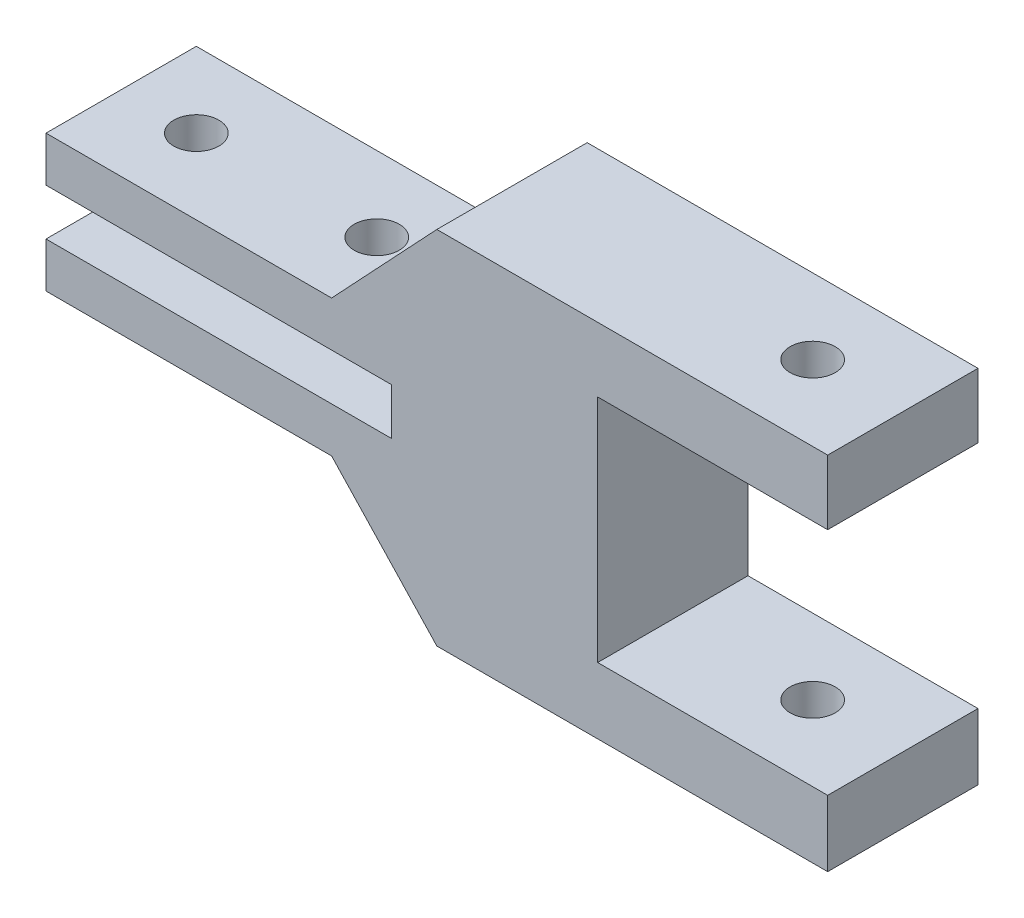
ISO-10303-21;
HEADER;
FILE_DESCRIPTION(('STEP AP214'),'2;1');
FILE_NAME('part.step','',(''),(''),'','','');
FILE_SCHEMA(('AUTOMOTIVE_DESIGN { 1 0 10303 214 1 1 1 1 }'));
ENDSEC;
DATA;
#1=APPLICATION_CONTEXT('core data for automotive mechanical design processes');
#2=APPLICATION_PROTOCOL_DEFINITION('international standard','automotive_design',2000,#1);
#3=PRODUCT_CONTEXT('',#1,'mechanical');
#4=PRODUCT('Part','Part','',(#3));
#5=PRODUCT_RELATED_PRODUCT_CATEGORY('part','',(#4));
#6=PRODUCT_DEFINITION_FORMATION('','',#4);
#7=PRODUCT_DEFINITION_CONTEXT('part definition',#1,'design');
#8=PRODUCT_DEFINITION('design','',#6,#7);
#9=PRODUCT_DEFINITION_SHAPE('','',#8);
#10=(LENGTH_UNIT() NAMED_UNIT(*) SI_UNIT(.MILLI.,.METRE.));
#11=(NAMED_UNIT(*) PLANE_ANGLE_UNIT() SI_UNIT($,.RADIAN.));
#12=(NAMED_UNIT(*) SI_UNIT($,.STERADIAN.) SOLID_ANGLE_UNIT());
#13=UNCERTAINTY_MEASURE_WITH_UNIT(LENGTH_MEASURE(1.E-05),#10,'distance_accuracy_value','');
#14=(GEOMETRIC_REPRESENTATION_CONTEXT(3) GLOBAL_UNCERTAINTY_ASSIGNED_CONTEXT((#13)) GLOBAL_UNIT_ASSIGNED_CONTEXT((#10,
#11,#12)) REPRESENTATION_CONTEXT('',''));
#15=CARTESIAN_POINT('',(0.,0.,0.));
#16=DIRECTION('',(0.,0.,1.));
#17=DIRECTION('',(1.,0.,0.));
#18=AXIS2_PLACEMENT_3D('',#15,#16,#17);
#19=CARTESIAN_POINT('',(26.,12.,10.));
#20=DIRECTION('',(1.,0.,0.));
#21=DIRECTION('',(0.,0.,-1.));
#22=AXIS2_PLACEMENT_3D('',#19,#20,#21);
#23=PLANE('',#22);
#24=DIRECTION('',(0.,0.,-1.));
#25=VECTOR('',#24,1.);
#26=CARTESIAN_POINT('',(26.,-7.6,31.6374675043084));
#27=LINE('',#26,#25);
#28=CARTESIAN_POINT('',(26.,-7.6,10.));
#29=VERTEX_POINT('',#28);
#30=CARTESIAN_POINT('',(26.,-7.6,0.));
#31=VERTEX_POINT('',#30);
#32=EDGE_CURVE('E244',#29,#31,#27,.T.);
#33=ORIENTED_EDGE('',*,*,#32,.F.);
#34=DIRECTION('',(0.,-1.,0.));
#35=VECTOR('',#34,1.);
#36=CARTESIAN_POINT('',(26.,12.,10.));
#37=LINE('',#36,#35);
#38=CARTESIAN_POINT('',(26.,-12.,10.));
#39=VERTEX_POINT('',#38);
#40=EDGE_CURVE('E166',#29,#39,#37,.T.);
#41=ORIENTED_EDGE('',*,*,#40,.T.);
#42=DIRECTION('',(0.,0.,-1.));
#43=VECTOR('',#42,1.);
#44=CARTESIAN_POINT('',(26.,-12.,10.));
#45=LINE('',#44,#43);
#46=CARTESIAN_POINT('',(26.,-12.,0.));
#47=VERTEX_POINT('',#46);
#48=EDGE_CURVE('E44',#39,#47,#45,.T.);
#49=ORIENTED_EDGE('',*,*,#48,.T.);
#50=DIRECTION('',(0.,-1.,0.));
#51=VECTOR('',#50,1.);
#52=CARTESIAN_POINT('',(26.,12.,0.));
#53=LINE('',#52,#51);
#54=EDGE_CURVE('E207',#31,#47,#53,.T.);
#55=ORIENTED_EDGE('',*,*,#54,.F.);
#56=EDGE_LOOP('',(#33,#41,#49,#55));
#57=FACE_BOUND('',#56,.T.);
#58=ADVANCED_FACE('F35',(#57),#23,.T.);
#59=CARTESIAN_POINT('',(0.,-12.,10.));
#60=DIRECTION('',(-0.728774104844871,-0.684754192471691,0.));
#61=DIRECTION('',(0.684754192471691,-0.728774104844871,0.));
#62=AXIS2_PLACEMENT_3D('',#59,#60,#61);
#63=PLANE('',#62);
#64=DIRECTION('',(-0.684754192471691,0.728774104844871,0.));
#65=VECTOR('',#64,1.);
#66=CARTESIAN_POINT('',(0.,-12.,0.));
#67=LINE('',#66,#65);
#68=CARTESIAN_POINT('',(0.,-12.,0.));
#69=VERTEX_POINT('',#68);
#70=CARTESIAN_POINT('',(-7.,-4.55,0.));
#71=VERTEX_POINT('',#70);
#72=EDGE_CURVE('E179',#69,#71,#67,.T.);
#73=ORIENTED_EDGE('',*,*,#72,.F.);
#74=DIRECTION('',(0.,0.,-1.));
#75=VECTOR('',#74,1.);
#76=CARTESIAN_POINT('',(0.,-12.,10.));
#77=LINE('',#76,#75);
#78=CARTESIAN_POINT('',(0.,-12.,10.));
#79=VERTEX_POINT('',#78);
#80=EDGE_CURVE('E11',#79,#69,#77,.T.);
#81=ORIENTED_EDGE('',*,*,#80,.F.);
#82=DIRECTION('',(-0.684754192471691,0.728774104844871,0.));
#83=VECTOR('',#82,1.);
#84=CARTESIAN_POINT('',(0.,-12.,10.));
#85=LINE('',#84,#83);
#86=CARTESIAN_POINT('',(-7.,-4.55,10.));
#87=VERTEX_POINT('',#86);
#88=EDGE_CURVE('E210',#79,#87,#85,.T.);
#89=ORIENTED_EDGE('',*,*,#88,.T.);
#90=DIRECTION('',(0.,0.,-1.));
#91=VECTOR('',#90,1.);
#92=CARTESIAN_POINT('',(-7.,-4.55,10.));
#93=LINE('',#92,#91);
#94=EDGE_CURVE('E178',#87,#71,#93,.T.);
#95=ORIENTED_EDGE('',*,*,#94,.T.);
#96=EDGE_LOOP('',(#73,#81,#89,#95));
#97=FACE_BOUND('',#96,.T.);
#98=ADVANCED_FACE('F37',(#97),#63,.T.);
#99=CARTESIAN_POINT('',(0.,-12.,10.));
#100=DIRECTION('',(0.,1.,0.));
#101=DIRECTION('',(-1.,0.,0.));
#102=AXIS2_PLACEMENT_3D('',#99,#100,#101);
#103=PLANE('',#102);
#104=CARTESIAN_POINT('',(20.,-12.,5.));
#105=DIRECTION('',(0.,-1.,0.));
#106=DIRECTION('',(1.,0.,0.));
#107=AXIS2_PLACEMENT_3D('',#104,#105,#106);
#108=CIRCLE('',#107,1.5);
#109=CARTESIAN_POINT('',(21.5,-12.,5.));
#110=VERTEX_POINT('',#109);
#111=EDGE_CURVE('E353',#110,#110,#108,.T.);
#112=ORIENTED_EDGE('',*,*,#111,.F.);
#113=EDGE_LOOP('',(#112));
#114=FACE_BOUND('',#113,.T.);
#115=DIRECTION('',(1.,0.,0.));
#116=VECTOR('',#115,1.);
#117=CARTESIAN_POINT('',(0.,-12.,0.));
#118=LINE('',#117,#116);
#119=EDGE_CURVE('E209',#69,#47,#118,.T.);
#120=ORIENTED_EDGE('',*,*,#119,.T.);
#121=ORIENTED_EDGE('',*,*,#48,.F.);
#122=DIRECTION('',(1.,0.,0.));
#123=VECTOR('',#122,1.);
#124=CARTESIAN_POINT('',(0.,-12.,10.));
#125=LINE('',#124,#123);
#126=EDGE_CURVE('E165',#79,#39,#125,.T.);
#127=ORIENTED_EDGE('',*,*,#126,.F.);
#128=ORIENTED_EDGE('',*,*,#80,.T.);
#129=EDGE_LOOP('',(#120,#121,#127,#128));
#130=FACE_BOUND('',#129,.T.);
#131=ADVANCED_FACE('F239',(#114,#130),#103,.F.);
#132=DIRECTION('',(0.,0.,-1.));
#133=VECTOR('',#132,1.);
#134=CARTESIAN_POINT('',(26.,7.7,31.6374675043084));
#135=LINE('',#134,#133);
#136=CARTESIAN_POINT('',(26.,7.7,10.));
#137=VERTEX_POINT('',#136);
#138=CARTESIAN_POINT('',(26.,7.7,0.));
#139=VERTEX_POINT('',#138);
#140=EDGE_CURVE('E374',#137,#139,#135,.T.);
#141=ORIENTED_EDGE('',*,*,#140,.T.);
#142=CARTESIAN_POINT('',(26.,12.,0.));
#143=VERTEX_POINT('',#142);
#144=EDGE_CURVE('E150',#143,#139,#53,.T.);
#145=ORIENTED_EDGE('',*,*,#144,.F.);
#146=DIRECTION('',(0.,0.,-1.));
#147=VECTOR('',#146,1.);
#148=CARTESIAN_POINT('',(26.,12.,10.));
#149=LINE('',#148,#147);
#150=CARTESIAN_POINT('',(26.,12.,10.));
#151=VERTEX_POINT('',#150);
#152=EDGE_CURVE('E143',#151,#143,#149,.T.);
#153=ORIENTED_EDGE('',*,*,#152,.F.);
#154=EDGE_CURVE('E148',#151,#137,#37,.T.);
#155=ORIENTED_EDGE('',*,*,#154,.T.);
#156=EDGE_LOOP('',(#141,#145,#153,#155));
#157=FACE_BOUND('',#156,.T.);
#158=ADVANCED_FACE('F146',(#157),#23,.T.);
#159=CARTESIAN_POINT('',(0.,12.,10.));
#160=DIRECTION('',(0.,1.,0.));
#161=DIRECTION('',(-1.,0.,0.));
#162=AXIS2_PLACEMENT_3D('',#159,#160,#161);
#163=PLANE('',#162);
#164=CARTESIAN_POINT('',(20.,12.,5.));
#165=DIRECTION('',(0.,-1.,0.));
#166=DIRECTION('',(1.,0.,0.));
#167=AXIS2_PLACEMENT_3D('',#164,#165,#166);
#168=CIRCLE('',#167,1.5);
#169=CARTESIAN_POINT('',(21.5,12.,5.));
#170=VERTEX_POINT('',#169);
#171=EDGE_CURVE('E362',#170,#170,#168,.T.);
#172=ORIENTED_EDGE('',*,*,#171,.T.);
#173=EDGE_LOOP('',(#172));
#174=FACE_BOUND('',#173,.T.);
#175=DIRECTION('',(1.,0.,0.));
#176=VECTOR('',#175,1.);
#177=CARTESIAN_POINT('',(0.,12.,0.));
#178=LINE('',#177,#176);
#179=CARTESIAN_POINT('',(0.,12.,0.));
#180=VERTEX_POINT('',#179);
#181=EDGE_CURVE('E205',#180,#143,#178,.T.);
#182=ORIENTED_EDGE('',*,*,#181,.F.);
#183=DIRECTION('',(0.,0.,-1.));
#184=VECTOR('',#183,1.);
#185=CARTESIAN_POINT('',(0.,12.,10.));
#186=LINE('',#185,#184);
#187=CARTESIAN_POINT('',(0.,12.,10.));
#188=VERTEX_POINT('',#187);
#189=EDGE_CURVE('E155',#188,#180,#186,.T.);
#190=ORIENTED_EDGE('',*,*,#189,.F.);
#191=DIRECTION('',(1.,0.,0.));
#192=VECTOR('',#191,1.);
#193=CARTESIAN_POINT('',(0.,12.,10.));
#194=LINE('',#193,#192);
#195=EDGE_CURVE('E161',#188,#151,#194,.T.);
#196=ORIENTED_EDGE('',*,*,#195,.T.);
#197=ORIENTED_EDGE('',*,*,#152,.T.);
#198=EDGE_LOOP('',(#182,#190,#196,#197));
#199=FACE_BOUND('',#198,.T.);
#200=ADVANCED_FACE('F168',(#174,#199),#163,.T.);
#201=CARTESIAN_POINT('',(0.,12.,10.));
#202=DIRECTION('',(0.728774104844871,-0.684754192471691,0.));
#203=DIRECTION('',(0.684754192471691,0.728774104844871,0.));
#204=AXIS2_PLACEMENT_3D('',#201,#202,#203);
#205=PLANE('',#204);
#206=DIRECTION('',(-0.684754192471691,-0.728774104844871,0.));
#207=VECTOR('',#206,1.);
#208=CARTESIAN_POINT('',(0.,12.,0.));
#209=LINE('',#208,#207);
#210=CARTESIAN_POINT('',(-7.,4.55,0.));
#211=VERTEX_POINT('',#210);
#212=EDGE_CURVE('E202',#180,#211,#209,.T.);
#213=ORIENTED_EDGE('',*,*,#212,.T.);
#214=DIRECTION('',(0.,0.,-1.));
#215=VECTOR('',#214,1.);
#216=CARTESIAN_POINT('',(-7.,4.55,10.));
#217=LINE('',#216,#215);
#218=CARTESIAN_POINT('',(-7.,4.55,10.));
#219=VERTEX_POINT('',#218);
#220=EDGE_CURVE('E215',#219,#211,#217,.T.);
#221=ORIENTED_EDGE('',*,*,#220,.F.);
#222=DIRECTION('',(-0.684754192471691,-0.728774104844871,0.));
#223=VECTOR('',#222,1.);
#224=CARTESIAN_POINT('',(0.,12.,10.));
#225=LINE('',#224,#223);
#226=EDGE_CURVE('E170',#188,#219,#225,.T.);
#227=ORIENTED_EDGE('',*,*,#226,.F.);
#228=ORIENTED_EDGE('',*,*,#189,.T.);
#229=EDGE_LOOP('',(#213,#221,#227,#228));
#230=FACE_BOUND('',#229,.T.);
#231=ADVANCED_FACE('F270',(#230),#205,.F.);
#232=CARTESIAN_POINT('',(-26.,4.55,10.));
#233=DIRECTION('',(0.,1.,0.));
#234=DIRECTION('',(0.,0.,1.));
#235=AXIS2_PLACEMENT_3D('',#232,#233,#234);
#236=PLANE('',#235);
#237=CARTESIAN_POINT('',(-21.,4.55,5.));
#238=DIRECTION('',(0.,1.,0.));
#239=DIRECTION('',(-1.,0.,0.));
#240=AXIS2_PLACEMENT_3D('',#237,#238,#239);
#241=CIRCLE('',#240,1.5);
#242=CARTESIAN_POINT('',(-22.5,4.55,5.));
#243=VERTEX_POINT('',#242);
#244=EDGE_CURVE('E383',#243,#243,#241,.T.);
#245=ORIENTED_EDGE('',*,*,#244,.F.);
#246=EDGE_LOOP('',(#245));
#247=FACE_BOUND('',#246,.T.);
#248=CARTESIAN_POINT('',(-9.,4.55,5.));
#249=DIRECTION('',(0.,1.,0.));
#250=DIRECTION('',(-1.,0.,0.));
#251=AXIS2_PLACEMENT_3D('',#248,#249,#250);
#252=CIRCLE('',#251,1.5);
#253=CARTESIAN_POINT('',(-10.5,4.55,5.));
#254=VERTEX_POINT('',#253);
#255=EDGE_CURVE('E382',#254,#254,#252,.T.);
#256=ORIENTED_EDGE('',*,*,#255,.F.);
#257=EDGE_LOOP('',(#256));
#258=FACE_BOUND('',#257,.T.);
#259=DIRECTION('',(1.,0.,0.));
#260=VECTOR('',#259,1.);
#261=CARTESIAN_POINT('',(-26.,4.55,0.));
#262=LINE('',#261,#260);
#263=CARTESIAN_POINT('',(-26.,4.55,0.));
#264=VERTEX_POINT('',#263);
#265=EDGE_CURVE('E199',#264,#211,#262,.T.);
#266=ORIENTED_EDGE('',*,*,#265,.F.);
#267=DIRECTION('',(0.,0.,-1.));
#268=VECTOR('',#267,1.);
#269=CARTESIAN_POINT('',(-26.,4.55,10.));
#270=LINE('',#269,#268);
#271=CARTESIAN_POINT('',(-26.,4.55,10.));
#272=VERTEX_POINT('',#271);
#273=EDGE_CURVE('E217',#272,#264,#270,.T.);
#274=ORIENTED_EDGE('',*,*,#273,.F.);
#275=DIRECTION('',(1.,0.,0.));
#276=VECTOR('',#275,1.);
#277=CARTESIAN_POINT('',(-26.,4.55,10.));
#278=LINE('',#277,#276);
#279=EDGE_CURVE('E172',#272,#219,#278,.T.);
#280=ORIENTED_EDGE('',*,*,#279,.T.);
#281=ORIENTED_EDGE('',*,*,#220,.T.);
#282=EDGE_LOOP('',(#266,#274,#280,#281));
#283=FACE_BOUND('',#282,.T.);
#284=ADVANCED_FACE('F265',(#247,#258,#283),#236,.T.);
#285=CARTESIAN_POINT('',(-26.,4.55,10.));
#286=DIRECTION('',(1.,0.,0.));
#287=DIRECTION('',(0.,0.,-1.));
#288=AXIS2_PLACEMENT_3D('',#285,#286,#287);
#289=PLANE('',#288);
#290=DIRECTION('',(0.,-1.,0.));
#291=VECTOR('',#290,1.);
#292=CARTESIAN_POINT('',(-26.,4.55,0.));
#293=LINE('',#292,#291);
#294=CARTESIAN_POINT('',(-26.,1.55,0.));
#295=VERTEX_POINT('',#294);
#296=EDGE_CURVE('E197',#264,#295,#293,.T.);
#297=ORIENTED_EDGE('',*,*,#296,.T.);
#298=DIRECTION('',(0.,0.,-1.));
#299=VECTOR('',#298,1.);
#300=CARTESIAN_POINT('',(-26.,1.55,10.));
#301=LINE('',#300,#299);
#302=CARTESIAN_POINT('',(-26.,1.55,10.));
#303=VERTEX_POINT('',#302);
#304=EDGE_CURVE('E219',#303,#295,#301,.T.);
#305=ORIENTED_EDGE('',*,*,#304,.F.);
#306=DIRECTION('',(0.,-1.,0.));
#307=VECTOR('',#306,1.);
#308=CARTESIAN_POINT('',(-26.,4.55,10.));
#309=LINE('',#308,#307);
#310=EDGE_CURVE('E260',#272,#303,#309,.T.);
#311=ORIENTED_EDGE('',*,*,#310,.F.);
#312=ORIENTED_EDGE('',*,*,#273,.T.);
#313=EDGE_LOOP('',(#297,#305,#311,#312));
#314=FACE_BOUND('',#313,.T.);
#315=ADVANCED_FACE('F276',(#314),#289,.F.);
#316=CARTESIAN_POINT('',(-26.,1.55,10.));
#317=DIRECTION('',(0.,1.,0.));
#318=DIRECTION('',(0.,0.,1.));
#319=AXIS2_PLACEMENT_3D('',#316,#317,#318);
#320=PLANE('',#319);
#321=CARTESIAN_POINT('',(-21.,1.55,5.));
#322=DIRECTION('',(0.,1.,0.));
#323=DIRECTION('',(0.,0.,1.));
#324=AXIS2_PLACEMENT_3D('',#321,#322,#323);
#325=CIRCLE('',#324,1.5);
#326=CARTESIAN_POINT('',(-21.,1.55,6.5));
#327=VERTEX_POINT('',#326);
#328=EDGE_CURVE('E183',#327,#327,#325,.T.);
#329=ORIENTED_EDGE('',*,*,#328,.T.);
#330=EDGE_LOOP('',(#329));
#331=FACE_BOUND('',#330,.T.);
#332=CARTESIAN_POINT('',(-9.,1.55,5.));
#333=DIRECTION('',(0.,1.,0.));
#334=DIRECTION('',(0.,0.,1.));
#335=AXIS2_PLACEMENT_3D('',#332,#333,#334);
#336=CIRCLE('',#335,1.5);
#337=CARTESIAN_POINT('',(-9.,1.55,6.5));
#338=VERTEX_POINT('',#337);
#339=EDGE_CURVE('E397',#338,#338,#336,.T.);
#340=ORIENTED_EDGE('',*,*,#339,.T.);
#341=EDGE_LOOP('',(#340));
#342=FACE_BOUND('',#341,.T.);
#343=DIRECTION('',(1.,0.,0.));
#344=VECTOR('',#343,1.);
#345=CARTESIAN_POINT('',(-26.,1.55,0.));
#346=LINE('',#345,#344);
#347=CARTESIAN_POINT('',(-3.,1.55,0.));
#348=VERTEX_POINT('',#347);
#349=EDGE_CURVE('E195',#295,#348,#346,.T.);
#350=ORIENTED_EDGE('',*,*,#349,.T.);
#351=DIRECTION('',(0.,0.,-1.));
#352=VECTOR('',#351,1.);
#353=CARTESIAN_POINT('',(-3.,1.55,10.));
#354=LINE('',#353,#352);
#355=CARTESIAN_POINT('',(-3.,1.55,10.));
#356=VERTEX_POINT('',#355);
#357=EDGE_CURVE('E222',#356,#348,#354,.T.);
#358=ORIENTED_EDGE('',*,*,#357,.F.);
#359=DIRECTION('',(1.,0.,0.));
#360=VECTOR('',#359,1.);
#361=CARTESIAN_POINT('',(-26.,1.55,10.));
#362=LINE('',#361,#360);
#363=EDGE_CURVE('E258',#303,#356,#362,.T.);
#364=ORIENTED_EDGE('',*,*,#363,.F.);
#365=ORIENTED_EDGE('',*,*,#304,.T.);
#366=EDGE_LOOP('',(#350,#358,#364,#365));
#367=FACE_BOUND('',#366,.T.);
#368=ADVANCED_FACE('F279',(#331,#342,#367),#320,.F.);
#369=CARTESIAN_POINT('',(-3.,1.55,10.));
#370=DIRECTION('',(1.,0.,0.));
#371=DIRECTION('',(0.,0.,-1.));
#372=AXIS2_PLACEMENT_3D('',#369,#370,#371);
#373=PLANE('',#372);
#374=DIRECTION('',(0.,-1.,0.));
#375=VECTOR('',#374,1.);
#376=CARTESIAN_POINT('',(-3.,1.55,0.));
#377=LINE('',#376,#375);
#378=CARTESIAN_POINT('',(-3.,-1.55,0.));
#379=VERTEX_POINT('',#378);
#380=EDGE_CURVE('E192',#348,#379,#377,.T.);
#381=ORIENTED_EDGE('',*,*,#380,.T.);
#382=DIRECTION('',(0.,0.,-1.));
#383=VECTOR('',#382,1.);
#384=CARTESIAN_POINT('',(-3.,-1.55,10.));
#385=LINE('',#384,#383);
#386=CARTESIAN_POINT('',(-3.,-1.55,10.));
#387=VERTEX_POINT('',#386);
#388=EDGE_CURVE('E225',#387,#379,#385,.T.);
#389=ORIENTED_EDGE('',*,*,#388,.F.);
#390=DIRECTION('',(0.,-1.,0.));
#391=VECTOR('',#390,1.);
#392=CARTESIAN_POINT('',(-3.,1.55,10.));
#393=LINE('',#392,#391);
#394=EDGE_CURVE('E256',#356,#387,#393,.T.);
#395=ORIENTED_EDGE('',*,*,#394,.F.);
#396=ORIENTED_EDGE('',*,*,#357,.T.);
#397=EDGE_LOOP('',(#381,#389,#395,#396));
#398=FACE_BOUND('',#397,.T.);
#399=ADVANCED_FACE('F285',(#398),#373,.F.);
#400=CARTESIAN_POINT('',(-26.,-1.55,10.));
#401=DIRECTION('',(0.,1.,0.));
#402=DIRECTION('',(0.,0.,1.));
#403=AXIS2_PLACEMENT_3D('',#400,#401,#402);
#404=PLANE('',#403);
#405=CARTESIAN_POINT('',(-21.,-1.55,5.));
#406=DIRECTION('',(0.,1.,0.));
#407=DIRECTION('',(0.,0.,1.));
#408=AXIS2_PLACEMENT_3D('',#405,#406,#407);
#409=CIRCLE('',#408,1.5);
#410=CARTESIAN_POINT('',(-21.,-1.55,6.5));
#411=VERTEX_POINT('',#410);
#412=EDGE_CURVE('E399',#411,#411,#409,.T.);
#413=ORIENTED_EDGE('',*,*,#412,.F.);
#414=EDGE_LOOP('',(#413));
#415=FACE_BOUND('',#414,.T.);
#416=CARTESIAN_POINT('',(-9.,-1.55,5.));
#417=DIRECTION('',(0.,1.,0.));
#418=DIRECTION('',(0.,0.,1.));
#419=AXIS2_PLACEMENT_3D('',#416,#417,#418);
#420=CIRCLE('',#419,1.5);
#421=CARTESIAN_POINT('',(-9.,-1.55,6.5));
#422=VERTEX_POINT('',#421);
#423=EDGE_CURVE('E390',#422,#422,#420,.T.);
#424=ORIENTED_EDGE('',*,*,#423,.F.);
#425=EDGE_LOOP('',(#424));
#426=FACE_BOUND('',#425,.T.);
#427=DIRECTION('',(1.,0.,0.));
#428=VECTOR('',#427,1.);
#429=CARTESIAN_POINT('',(-26.,-1.55,0.));
#430=LINE('',#429,#428);
#431=CARTESIAN_POINT('',(-26.,-1.55,0.));
#432=VERTEX_POINT('',#431);
#433=EDGE_CURVE('E189',#432,#379,#430,.T.);
#434=ORIENTED_EDGE('',*,*,#433,.F.);
#435=DIRECTION('',(0.,0.,-1.));
#436=VECTOR('',#435,1.);
#437=CARTESIAN_POINT('',(-26.,-1.55,10.));
#438=LINE('',#437,#436);
#439=CARTESIAN_POINT('',(-26.,-1.55,10.));
#440=VERTEX_POINT('',#439);
#441=EDGE_CURVE('E227',#440,#432,#438,.T.);
#442=ORIENTED_EDGE('',*,*,#441,.F.);
#443=DIRECTION('',(1.,0.,0.));
#444=VECTOR('',#443,1.);
#445=CARTESIAN_POINT('',(-26.,-1.55,10.));
#446=LINE('',#445,#444);
#447=EDGE_CURVE('E253',#440,#387,#446,.T.);
#448=ORIENTED_EDGE('',*,*,#447,.T.);
#449=ORIENTED_EDGE('',*,*,#388,.T.);
#450=EDGE_LOOP('',(#434,#442,#448,#449));
#451=FACE_BOUND('',#450,.T.);
#452=ADVANCED_FACE('F288',(#415,#426,#451),#404,.T.);
#453=CARTESIAN_POINT('',(-26.,-4.55,10.));
#454=DIRECTION('',(-1.,0.,0.));
#455=DIRECTION('',(0.,0.,1.));
#456=AXIS2_PLACEMENT_3D('',#453,#454,#455);
#457=PLANE('',#456);
#458=DIRECTION('',(0.,1.,0.));
#459=VECTOR('',#458,1.);
#460=CARTESIAN_POINT('',(-26.,-4.55,0.));
#461=LINE('',#460,#459);
#462=CARTESIAN_POINT('',(-26.,-4.55,0.));
#463=VERTEX_POINT('',#462);
#464=EDGE_CURVE('E186',#463,#432,#461,.T.);
#465=ORIENTED_EDGE('',*,*,#464,.F.);
#466=DIRECTION('',(0.,0.,-1.));
#467=VECTOR('',#466,1.);
#468=CARTESIAN_POINT('',(-26.,-4.55,10.));
#469=LINE('',#468,#467);
#470=CARTESIAN_POINT('',(-26.,-4.55,10.));
#471=VERTEX_POINT('',#470);
#472=EDGE_CURVE('E229',#471,#463,#469,.T.);
#473=ORIENTED_EDGE('',*,*,#472,.F.);
#474=DIRECTION('',(0.,1.,0.));
#475=VECTOR('',#474,1.);
#476=CARTESIAN_POINT('',(-26.,-4.55,10.));
#477=LINE('',#476,#475);
#478=EDGE_CURVE('E246',#471,#440,#477,.T.);
#479=ORIENTED_EDGE('',*,*,#478,.T.);
#480=ORIENTED_EDGE('',*,*,#441,.T.);
#481=EDGE_LOOP('',(#465,#473,#479,#480));
#482=FACE_BOUND('',#481,.T.);
#483=ADVANCED_FACE('F290',(#482),#457,.T.);
#484=CARTESIAN_POINT('',(-26.,-4.55,10.));
#485=DIRECTION('',(0.,1.,0.));
#486=DIRECTION('',(0.,0.,1.));
#487=AXIS2_PLACEMENT_3D('',#484,#485,#486);
#488=PLANE('',#487);
#489=CARTESIAN_POINT('',(-21.,-4.55,5.));
#490=DIRECTION('',(0.,1.,0.));
#491=DIRECTION('',(0.,0.,1.));
#492=AXIS2_PLACEMENT_3D('',#489,#490,#491);
#493=CIRCLE('',#492,1.5);
#494=CARTESIAN_POINT('',(-21.,-4.55,6.5));
#495=VERTEX_POINT('',#494);
#496=EDGE_CURVE('E386',#495,#495,#493,.F.);
#497=ORIENTED_EDGE('',*,*,#496,.F.);
#498=EDGE_LOOP('',(#497));
#499=FACE_BOUND('',#498,.T.);
#500=CARTESIAN_POINT('',(-9.,-4.55,5.));
#501=DIRECTION('',(0.,1.,0.));
#502=DIRECTION('',(0.,0.,1.));
#503=AXIS2_PLACEMENT_3D('',#500,#501,#502);
#504=CIRCLE('',#503,1.5);
#505=CARTESIAN_POINT('',(-9.,-4.55,6.5));
#506=VERTEX_POINT('',#505);
#507=EDGE_CURVE('E387',#506,#506,#504,.F.);
#508=ORIENTED_EDGE('',*,*,#507,.F.);
#509=EDGE_LOOP('',(#508));
#510=FACE_BOUND('',#509,.T.);
#511=DIRECTION('',(1.,0.,0.));
#512=VECTOR('',#511,1.);
#513=CARTESIAN_POINT('',(-26.,-4.55,0.));
#514=LINE('',#513,#512);
#515=EDGE_CURVE('E182',#463,#71,#514,.T.);
#516=ORIENTED_EDGE('',*,*,#515,.T.);
#517=ORIENTED_EDGE('',*,*,#94,.F.);
#518=DIRECTION('',(1.,0.,0.));
#519=VECTOR('',#518,1.);
#520=CARTESIAN_POINT('',(-26.,-4.55,10.));
#521=LINE('',#520,#519);
#522=EDGE_CURVE('E111',#471,#87,#521,.T.);
#523=ORIENTED_EDGE('',*,*,#522,.F.);
#524=ORIENTED_EDGE('',*,*,#472,.T.);
#525=EDGE_LOOP('',(#516,#517,#523,#524));
#526=FACE_BOUND('',#525,.T.);
#527=ADVANCED_FACE('F232',(#499,#510,#526),#488,.F.);
#528=CARTESIAN_POINT('',(0.,0.,10.));
#529=DIRECTION('',(0.,0.,1.));
#530=DIRECTION('',(1.,0.,0.));
#531=AXIS2_PLACEMENT_3D('',#528,#529,#530);
#532=PLANE('',#531);
#533=DIRECTION('',(-1.,0.,0.));
#534=VECTOR('',#533,1.);
#535=CARTESIAN_POINT('',(26.,-7.6,10.));
#536=LINE('',#535,#534);
#537=CARTESIAN_POINT('',(10.7,-7.6,10.));
#538=VERTEX_POINT('',#537);
#539=EDGE_CURVE('E369',#29,#538,#536,.T.);
#540=ORIENTED_EDGE('',*,*,#539,.T.);
#541=DIRECTION('',(0.,1.,0.));
#542=VECTOR('',#541,1.);
#543=CARTESIAN_POINT('',(10.7,7.7,10.));
#544=LINE('',#543,#542);
#545=CARTESIAN_POINT('',(10.7,7.7,10.));
#546=VERTEX_POINT('',#545);
#547=EDGE_CURVE('E376',#538,#546,#544,.T.);
#548=ORIENTED_EDGE('',*,*,#547,.T.);
#549=DIRECTION('',(1.,0.,0.));
#550=VECTOR('',#549,1.);
#551=CARTESIAN_POINT('',(26.,7.7,10.));
#552=LINE('',#551,#550);
#553=EDGE_CURVE('E164',#546,#137,#552,.T.);
#554=ORIENTED_EDGE('',*,*,#553,.T.);
#555=ORIENTED_EDGE('',*,*,#154,.F.);
#556=ORIENTED_EDGE('',*,*,#195,.F.);
#557=ORIENTED_EDGE('',*,*,#226,.T.);
#558=ORIENTED_EDGE('',*,*,#279,.F.);
#559=ORIENTED_EDGE('',*,*,#310,.T.);
#560=ORIENTED_EDGE('',*,*,#363,.T.);
#561=ORIENTED_EDGE('',*,*,#394,.T.);
#562=ORIENTED_EDGE('',*,*,#447,.F.);
#563=ORIENTED_EDGE('',*,*,#478,.F.);
#564=ORIENTED_EDGE('',*,*,#522,.T.);
#565=ORIENTED_EDGE('',*,*,#88,.F.);
#566=ORIENTED_EDGE('',*,*,#126,.T.);
#567=ORIENTED_EDGE('',*,*,#40,.F.);
#568=EDGE_LOOP('',(#540,#548,#554,#555,#556,#557,#558,#559,#560,#561,#562,#563,#564,#565,#566,#567));
#569=FACE_BOUND('',#568,.T.);
#570=ADVANCED_FACE('F160',(#569),#532,.T.);
#571=CARTESIAN_POINT('',(0.,0.,0.));
#572=DIRECTION('',(0.,0.,1.));
#573=DIRECTION('',(1.,0.,0.));
#574=AXIS2_PLACEMENT_3D('',#571,#572,#573);
#575=PLANE('',#574);
#576=DIRECTION('',(0.,1.,0.));
#577=VECTOR('',#576,1.);
#578=CARTESIAN_POINT('',(10.7,7.7,0.));
#579=LINE('',#578,#577);
#580=CARTESIAN_POINT('',(10.7,-7.6,0.));
#581=VERTEX_POINT('',#580);
#582=CARTESIAN_POINT('',(10.7,7.7,0.));
#583=VERTEX_POINT('',#582);
#584=EDGE_CURVE('E52',#581,#583,#579,.T.);
#585=ORIENTED_EDGE('',*,*,#584,.F.);
#586=DIRECTION('',(-1.,0.,0.));
#587=VECTOR('',#586,1.);
#588=CARTESIAN_POINT('',(26.,-7.6,0.));
#589=LINE('',#588,#587);
#590=EDGE_CURVE('E357',#31,#581,#589,.T.);
#591=ORIENTED_EDGE('',*,*,#590,.F.);
#592=ORIENTED_EDGE('',*,*,#54,.T.);
#593=ORIENTED_EDGE('',*,*,#119,.F.);
#594=ORIENTED_EDGE('',*,*,#72,.T.);
#595=ORIENTED_EDGE('',*,*,#515,.F.);
#596=ORIENTED_EDGE('',*,*,#464,.T.);
#597=ORIENTED_EDGE('',*,*,#433,.T.);
#598=ORIENTED_EDGE('',*,*,#380,.F.);
#599=ORIENTED_EDGE('',*,*,#349,.F.);
#600=ORIENTED_EDGE('',*,*,#296,.F.);
#601=ORIENTED_EDGE('',*,*,#265,.T.);
#602=ORIENTED_EDGE('',*,*,#212,.F.);
#603=ORIENTED_EDGE('',*,*,#181,.T.);
#604=ORIENTED_EDGE('',*,*,#144,.T.);
#605=DIRECTION('',(1.,0.,0.));
#606=VECTOR('',#605,1.);
#607=CARTESIAN_POINT('',(26.,7.7,0.));
#608=LINE('',#607,#606);
#609=EDGE_CURVE('E366',#583,#139,#608,.T.);
#610=ORIENTED_EDGE('',*,*,#609,.F.);
#611=EDGE_LOOP('',(#585,#591,#592,#593,#594,#595,#596,#597,#598,#599,#600,#601,#602,#603,#604,#610));
#612=FACE_BOUND('',#611,.T.);
#613=ADVANCED_FACE('F235',(#612),#575,.F.);
#614=CARTESIAN_POINT('',(-9.,-8.7926406871193,5.));
#615=DIRECTION('',(0.,1.,0.));
#616=DIRECTION('',(-1.,0.,0.));
#617=AXIS2_PLACEMENT_3D('',#614,#615,#616);
#618=CYLINDRICAL_SURFACE('',#617,1.5);
#619=ORIENTED_EDGE('',*,*,#423,.T.);
#620=EDGE_LOOP('',(#619));
#621=FACE_BOUND('',#620,.T.);
#622=ORIENTED_EDGE('',*,*,#507,.T.);
#623=EDGE_LOOP('',(#622));
#624=FACE_BOUND('',#623,.T.);
#625=ADVANCED_FACE('F320',(#621,#624),#618,.F.);
#626=CARTESIAN_POINT('',(-21.,-8.7926406871193,5.));
#627=DIRECTION('',(0.,1.,0.));
#628=DIRECTION('',(-1.,0.,0.));
#629=AXIS2_PLACEMENT_3D('',#626,#627,#628);
#630=CYLINDRICAL_SURFACE('',#629,1.5);
#631=ORIENTED_EDGE('',*,*,#412,.T.);
#632=EDGE_LOOP('',(#631));
#633=FACE_BOUND('',#632,.T.);
#634=ORIENTED_EDGE('',*,*,#496,.T.);
#635=EDGE_LOOP('',(#634));
#636=FACE_BOUND('',#635,.T.);
#637=ADVANCED_FACE('F325',(#633,#636),#630,.F.);
#638=ORIENTED_EDGE('',*,*,#255,.T.);
#639=EDGE_LOOP('',(#638));
#640=FACE_BOUND('',#639,.T.);
#641=ORIENTED_EDGE('',*,*,#339,.F.);
#642=EDGE_LOOP('',(#641));
#643=FACE_BOUND('',#642,.T.);
#644=ADVANCED_FACE('F327',(#640,#643),#618,.F.);
#645=ORIENTED_EDGE('',*,*,#244,.T.);
#646=EDGE_LOOP('',(#645));
#647=FACE_BOUND('',#646,.T.);
#648=ORIENTED_EDGE('',*,*,#328,.F.);
#649=EDGE_LOOP('',(#648));
#650=FACE_BOUND('',#649,.T.);
#651=ADVANCED_FACE('F331',(#647,#650),#630,.F.);
#652=CARTESIAN_POINT('',(26.,-7.6,31.6374675043084));
#653=DIRECTION('',(0.,-1.,0.));
#654=DIRECTION('',(0.,0.,-1.));
#655=AXIS2_PLACEMENT_3D('',#652,#653,#654);
#656=PLANE('',#655);
#657=CARTESIAN_POINT('',(20.,-7.60000000000001,5.));
#658=DIRECTION('',(0.,-1.,0.));
#659=DIRECTION('',(0.,0.,-1.));
#660=AXIS2_PLACEMENT_3D('',#657,#658,#659);
#661=CIRCLE('',#660,1.5);
#662=CARTESIAN_POINT('',(20.,-7.60000000000001,3.5));
#663=VERTEX_POINT('',#662);
#664=EDGE_CURVE('E356',#663,#663,#661,.T.);
#665=ORIENTED_EDGE('',*,*,#664,.T.);
#666=EDGE_LOOP('',(#665));
#667=FACE_BOUND('',#666,.T.);
#668=ORIENTED_EDGE('',*,*,#32,.T.);
#669=ORIENTED_EDGE('',*,*,#590,.T.);
#670=DIRECTION('',(0.,0.,-1.));
#671=VECTOR('',#670,1.);
#672=CARTESIAN_POINT('',(10.7,-7.6,31.6374675043084));
#673=LINE('',#672,#671);
#674=EDGE_CURVE('E372',#538,#581,#673,.T.);
#675=ORIENTED_EDGE('',*,*,#674,.F.);
#676=ORIENTED_EDGE('',*,*,#539,.F.);
#677=EDGE_LOOP('',(#668,#669,#675,#676));
#678=FACE_BOUND('',#677,.T.);
#679=ADVANCED_FACE('F332',(#667,#678),#656,.F.);
#680=CARTESIAN_POINT('',(10.7,7.7,31.6374675043084));
#681=DIRECTION('',(-1.,0.,0.));
#682=DIRECTION('',(0.,0.,1.));
#683=AXIS2_PLACEMENT_3D('',#680,#681,#682);
#684=PLANE('',#683);
#685=ORIENTED_EDGE('',*,*,#674,.T.);
#686=ORIENTED_EDGE('',*,*,#584,.T.);
#687=DIRECTION('',(0.,0.,-1.));
#688=VECTOR('',#687,1.);
#689=CARTESIAN_POINT('',(10.7,7.7,31.6374675043084));
#690=LINE('',#689,#688);
#691=EDGE_CURVE('E375',#546,#583,#690,.T.);
#692=ORIENTED_EDGE('',*,*,#691,.F.);
#693=ORIENTED_EDGE('',*,*,#547,.F.);
#694=EDGE_LOOP('',(#685,#686,#692,#693));
#695=FACE_BOUND('',#694,.T.);
#696=ADVANCED_FACE('F335',(#695),#684,.F.);
#697=CARTESIAN_POINT('',(26.,7.7,31.6374675043084));
#698=DIRECTION('',(0.,1.,0.));
#699=DIRECTION('',(0.,0.,1.));
#700=AXIS2_PLACEMENT_3D('',#697,#698,#699);
#701=PLANE('',#700);
#702=CARTESIAN_POINT('',(20.,7.7,5.));
#703=DIRECTION('',(0.,1.,0.));
#704=DIRECTION('',(0.,0.,1.));
#705=AXIS2_PLACEMENT_3D('',#702,#703,#704);
#706=CIRCLE('',#705,1.5);
#707=CARTESIAN_POINT('',(20.,7.7,6.5));
#708=VERTEX_POINT('',#707);
#709=EDGE_CURVE('E39',#708,#708,#706,.T.);
#710=ORIENTED_EDGE('',*,*,#709,.T.);
#711=EDGE_LOOP('',(#710));
#712=FACE_BOUND('',#711,.T.);
#713=ORIENTED_EDGE('',*,*,#691,.T.);
#714=ORIENTED_EDGE('',*,*,#609,.T.);
#715=ORIENTED_EDGE('',*,*,#140,.F.);
#716=ORIENTED_EDGE('',*,*,#553,.F.);
#717=EDGE_LOOP('',(#713,#714,#715,#716));
#718=FACE_BOUND('',#717,.T.);
#719=ADVANCED_FACE('F339',(#712,#718),#701,.F.);
#720=CARTESIAN_POINT('',(20.,12.,5.));
#721=DIRECTION('',(0.,-1.,0.));
#722=DIRECTION('',(1.,0.,0.));
#723=AXIS2_PLACEMENT_3D('',#720,#721,#722);
#724=CYLINDRICAL_SURFACE('',#723,1.5);
#725=ORIENTED_EDGE('',*,*,#171,.F.);
#726=EDGE_LOOP('',(#725));
#727=FACE_BOUND('',#726,.T.);
#728=ORIENTED_EDGE('',*,*,#709,.F.);
#729=EDGE_LOOP('',(#728));
#730=FACE_BOUND('',#729,.T.);
#731=ADVANCED_FACE('F342',(#727,#730),#724,.F.);
#732=ORIENTED_EDGE('',*,*,#111,.T.);
#733=EDGE_LOOP('',(#732));
#734=FACE_BOUND('',#733,.T.);
#735=ORIENTED_EDGE('',*,*,#664,.F.);
#736=EDGE_LOOP('',(#735));
#737=FACE_BOUND('',#736,.T.);
#738=ADVANCED_FACE('F344',(#734,#737),#724,.F.);
#739=CLOSED_SHELL('',(#58,#98,#131,#158,#200,#231,#284,#315,#368,#399,#452,#483,#527,#570,#613,
#625,#637,#644,#651,#679,#696,#719,#731,#738));
#740=MANIFOLD_SOLID_BREP('B2',#739);
#741=ADVANCED_BREP_SHAPE_REPRESENTATION('',(#18,#740),#14);
#742=SHAPE_DEFINITION_REPRESENTATION(#9,#741);
ENDSEC;
END-ISO-10303-21;
